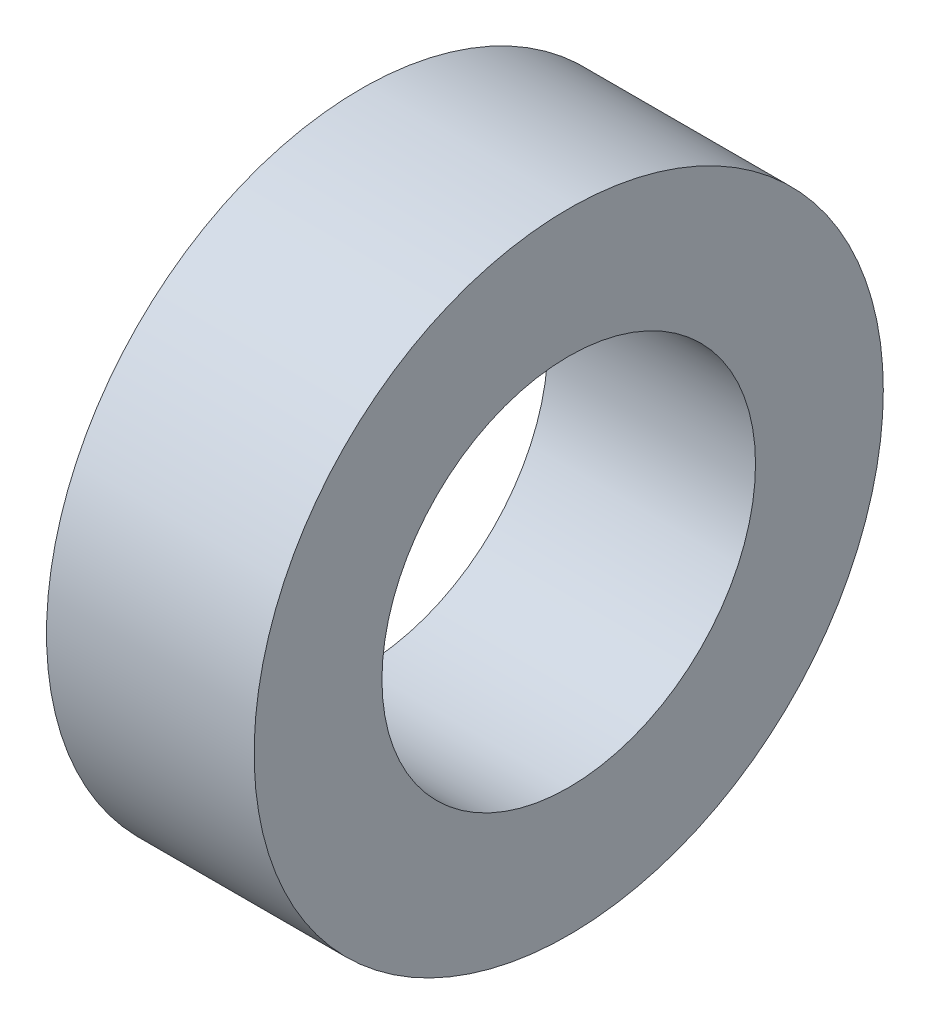
ISO-10303-21;
HEADER;
FILE_DESCRIPTION(('STEP AP214'),'2;1');
FILE_NAME('part.step','',(''),(''),'','','');
FILE_SCHEMA(('AUTOMOTIVE_DESIGN { 1 0 10303 214 1 1 1 1 }'));
ENDSEC;
DATA;
#1=APPLICATION_CONTEXT('core data for automotive mechanical design processes');
#2=APPLICATION_PROTOCOL_DEFINITION('international standard','automotive_design',2000,#1);
#3=PRODUCT_CONTEXT('',#1,'mechanical');
#4=PRODUCT('Part','Part','',(#3));
#5=PRODUCT_RELATED_PRODUCT_CATEGORY('part','',(#4));
#6=PRODUCT_DEFINITION_FORMATION('','',#4);
#7=PRODUCT_DEFINITION_CONTEXT('part definition',#1,'design');
#8=PRODUCT_DEFINITION('design','',#6,#7);
#9=PRODUCT_DEFINITION_SHAPE('','',#8);
#10=(LENGTH_UNIT() NAMED_UNIT(*) SI_UNIT(.MILLI.,.METRE.));
#11=(NAMED_UNIT(*) PLANE_ANGLE_UNIT() SI_UNIT($,.RADIAN.));
#12=(NAMED_UNIT(*) SI_UNIT($,.STERADIAN.) SOLID_ANGLE_UNIT());
#13=UNCERTAINTY_MEASURE_WITH_UNIT(LENGTH_MEASURE(1.E-05),#10,'distance_accuracy_value','');
#14=(GEOMETRIC_REPRESENTATION_CONTEXT(3) GLOBAL_UNCERTAINTY_ASSIGNED_CONTEXT((#13)) GLOBAL_UNIT_ASSIGNED_CONTEXT((#10,
#11,#12)) REPRESENTATION_CONTEXT('',''));
#15=CARTESIAN_POINT('',(0.,0.,0.));
#16=DIRECTION('',(0.,0.,1.));
#17=DIRECTION('',(1.,0.,0.));
#18=AXIS2_PLACEMENT_3D('',#15,#16,#17);
#19=CARTESIAN_POINT('',(8.382,0.,0.));
#20=DIRECTION('',(1.,0.,0.));
#21=DIRECTION('',(0.,0.,-1.));
#22=AXIS2_PLACEMENT_3D('',#19,#20,#21);
#23=PLANE('',#22);
#24=CARTESIAN_POINT('',(8.382,0.,0.));
#25=DIRECTION('',(1.,0.,0.));
#26=DIRECTION('',(0.,0.,-1.));
#27=AXIS2_PLACEMENT_3D('',#24,#25,#26);
#28=CIRCLE('',#27,12.7);
#29=CARTESIAN_POINT('',(8.382,0.,-12.7));
#30=VERTEX_POINT('',#29);
#31=EDGE_CURVE('E10',#30,#30,#28,.T.);
#32=ORIENTED_EDGE('',*,*,#31,.T.);
#33=EDGE_LOOP('',(#32));
#34=FACE_BOUND('',#33,.T.);
#35=CARTESIAN_POINT('',(8.382,0.,0.));
#36=DIRECTION('',(1.,0.,0.));
#37=DIRECTION('',(0.,0.,-1.));
#38=AXIS2_PLACEMENT_3D('',#35,#36,#37);
#39=CIRCLE('',#38,7.540625);
#40=CARTESIAN_POINT('',(8.382,0.,-7.540625));
#41=VERTEX_POINT('',#40);
#42=EDGE_CURVE('E42',#41,#41,#39,.T.);
#43=ORIENTED_EDGE('',*,*,#42,.F.);
#44=EDGE_LOOP('',(#43));
#45=FACE_BOUND('',#44,.T.);
#46=ADVANCED_FACE('F31',(#34,#45),#23,.T.);
#47=CARTESIAN_POINT('',(0.,0.,0.));
#48=DIRECTION('',(1.,0.,0.));
#49=DIRECTION('',(0.,0.,-1.));
#50=AXIS2_PLACEMENT_3D('',#47,#48,#49);
#51=PLANE('',#50);
#52=CARTESIAN_POINT('',(0.,0.,0.));
#53=DIRECTION('',(1.,0.,0.));
#54=DIRECTION('',(0.,0.,-1.));
#55=AXIS2_PLACEMENT_3D('',#52,#53,#54);
#56=CIRCLE('',#55,12.7);
#57=CARTESIAN_POINT('',(0.,0.,-12.7));
#58=VERTEX_POINT('',#57);
#59=EDGE_CURVE('E35',#58,#58,#56,.T.);
#60=ORIENTED_EDGE('',*,*,#59,.F.);
#61=EDGE_LOOP('',(#60));
#62=FACE_BOUND('',#61,.T.);
#63=CARTESIAN_POINT('',(0.,0.,0.));
#64=DIRECTION('',(1.,0.,0.));
#65=DIRECTION('',(0.,0.,-1.));
#66=AXIS2_PLACEMENT_3D('',#63,#64,#65);
#67=CIRCLE('',#66,7.540625);
#68=CARTESIAN_POINT('',(0.,0.,-7.540625));
#69=VERTEX_POINT('',#68);
#70=EDGE_CURVE('E44',#69,#69,#67,.T.);
#71=ORIENTED_EDGE('',*,*,#70,.T.);
#72=EDGE_LOOP('',(#71));
#73=FACE_BOUND('',#72,.T.);
#74=ADVANCED_FACE('F54',(#62,#73),#51,.F.);
#75=CARTESIAN_POINT('',(8.382,0.,0.));
#76=DIRECTION('',(-1.,0.,0.));
#77=DIRECTION('',(0.,0.,1.));
#78=AXIS2_PLACEMENT_3D('',#75,#76,#77);
#79=CYLINDRICAL_SURFACE('',#78,12.7);
#80=ORIENTED_EDGE('',*,*,#31,.F.);
#81=EDGE_LOOP('',(#80));
#82=FACE_BOUND('',#81,.T.);
#83=ORIENTED_EDGE('',*,*,#59,.T.);
#84=EDGE_LOOP('',(#83));
#85=FACE_BOUND('',#84,.T.);
#86=ADVANCED_FACE('F33',(#82,#85),#79,.T.);
#87=CARTESIAN_POINT('',(8.382,0.,0.));
#88=DIRECTION('',(-1.,0.,0.));
#89=DIRECTION('',(0.,0.,1.));
#90=AXIS2_PLACEMENT_3D('',#87,#88,#89);
#91=CYLINDRICAL_SURFACE('',#90,7.540625);
#92=ORIENTED_EDGE('',*,*,#42,.T.);
#93=EDGE_LOOP('',(#92));
#94=FACE_BOUND('',#93,.T.);
#95=ORIENTED_EDGE('',*,*,#70,.F.);
#96=EDGE_LOOP('',(#95));
#97=FACE_BOUND('',#96,.T.);
#98=ADVANCED_FACE('F50',(#94,#97),#91,.F.);
#99=CLOSED_SHELL('',(#46,#74,#86,#98));
#100=MANIFOLD_SOLID_BREP('B2',#99);
#101=ADVANCED_BREP_SHAPE_REPRESENTATION('',(#18,#100),#14);
#102=SHAPE_DEFINITION_REPRESENTATION(#9,#101);
ENDSEC;
END-ISO-10303-21;
